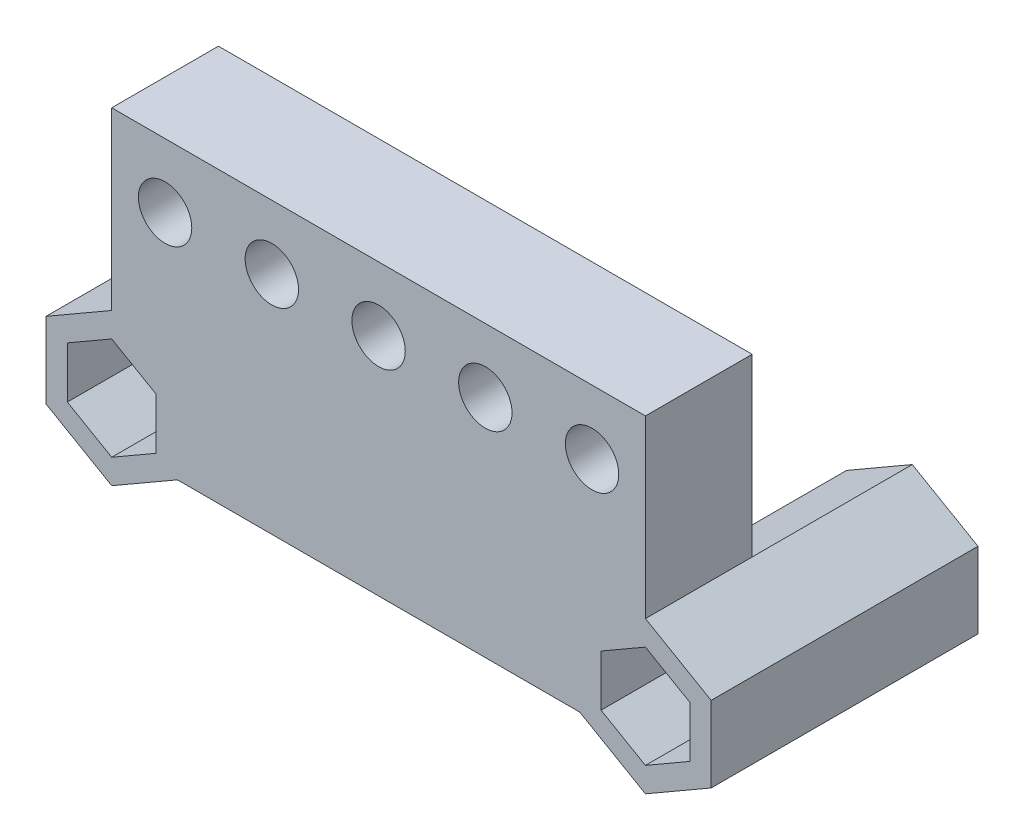
ISO-10303-21;
HEADER;
FILE_DESCRIPTION(('STEP AP214'),'2;1');
FILE_NAME('part.step','',(''),(''),'','','');
FILE_SCHEMA(('AUTOMOTIVE_DESIGN { 1 0 10303 214 1 1 1 1 }'));
ENDSEC;
DATA;
#1=APPLICATION_CONTEXT('core data for automotive mechanical design processes');
#2=APPLICATION_PROTOCOL_DEFINITION('international standard','automotive_design',2000,#1);
#3=PRODUCT_CONTEXT('',#1,'mechanical');
#4=PRODUCT('Part','Part','',(#3));
#5=PRODUCT_RELATED_PRODUCT_CATEGORY('part','',(#4));
#6=PRODUCT_DEFINITION_FORMATION('','',#4);
#7=PRODUCT_DEFINITION_CONTEXT('part definition',#1,'design');
#8=PRODUCT_DEFINITION('design','',#6,#7);
#9=PRODUCT_DEFINITION_SHAPE('','',#8);
#10=(LENGTH_UNIT() NAMED_UNIT(*) SI_UNIT(.MILLI.,.METRE.));
#11=(NAMED_UNIT(*) PLANE_ANGLE_UNIT() SI_UNIT($,.RADIAN.));
#12=(NAMED_UNIT(*) SI_UNIT($,.STERADIAN.) SOLID_ANGLE_UNIT());
#13=UNCERTAINTY_MEASURE_WITH_UNIT(LENGTH_MEASURE(1.E-05),#10,'distance_accuracy_value','');
#14=(GEOMETRIC_REPRESENTATION_CONTEXT(3) GLOBAL_UNCERTAINTY_ASSIGNED_CONTEXT((#13)) GLOBAL_UNIT_ASSIGNED_CONTEXT((#10,
#11,#12)) REPRESENTATION_CONTEXT('',''));
#15=CARTESIAN_POINT('',(0.,0.,0.));
#16=DIRECTION('',(0.,0.,1.));
#17=DIRECTION('',(1.,0.,0.));
#18=AXIS2_PLACEMENT_3D('',#15,#16,#17);
#19=CARTESIAN_POINT('',(6.15692193816531,3.55470053837925,25.));
#20=DIRECTION('',(-0.5,-0.866025403784439,0.));
#21=DIRECTION('',(0.866025403784439,-0.5,0.));
#22=AXIS2_PLACEMENT_3D('',#19,#20,#21);
#23=PLANE('',#22);
#24=DIRECTION('',(-0.866025403784439,0.5,0.));
#25=VECTOR('',#24,1.);
#26=CARTESIAN_POINT('',(6.15692193816531,3.55470053837925,15.));
#27=LINE('',#26,#25);
#28=CARTESIAN_POINT('',(6.15692193816531,3.55470053837925,15.));
#29=VERTEX_POINT('',#28);
#30=CARTESIAN_POINT('',(0.,7.1094010767585,15.));
#31=VERTEX_POINT('',#30);
#32=EDGE_CURVE('E366',#29,#31,#27,.T.);
#33=ORIENTED_EDGE('',*,*,#32,.F.);
#34=DIRECTION('',(0.,0.,-1.));
#35=VECTOR('',#34,1.);
#36=CARTESIAN_POINT('',(6.15692193816531,3.55470053837925,25.));
#37=LINE('',#36,#35);
#38=CARTESIAN_POINT('',(6.15692193816531,3.55470053837925,0.));
#39=VERTEX_POINT('',#38);
#40=EDGE_CURVE('E445',#29,#39,#37,.T.);
#41=ORIENTED_EDGE('',*,*,#40,.T.);
#42=DIRECTION('',(-0.866025403784439,0.5,0.));
#43=VECTOR('',#42,1.);
#44=CARTESIAN_POINT('',(6.15692193816531,3.55470053837925,0.));
#45=LINE('',#44,#43);
#46=CARTESIAN_POINT('',(0.,7.1094010767585,0.));
#47=VERTEX_POINT('',#46);
#48=EDGE_CURVE('E426',#39,#47,#45,.T.);
#49=ORIENTED_EDGE('',*,*,#48,.T.);
#50=DIRECTION('',(0.,0.,-1.));
#51=VECTOR('',#50,1.);
#52=CARTESIAN_POINT('',(0.,7.1094010767585,25.));
#53=LINE('',#52,#51);
#54=EDGE_CURVE('E50',#31,#47,#53,.T.);
#55=ORIENTED_EDGE('',*,*,#54,.F.);
#56=EDGE_LOOP('',(#33,#41,#49,#55));
#57=FACE_BOUND('',#56,.T.);
#58=ADVANCED_FACE('F33',(#57),#23,.F.);
#59=CARTESIAN_POINT('',(50.,7.10940107675851,25.));
#60=DIRECTION('',(0.5,-0.866025403784439,0.));
#61=DIRECTION('',(0.866025403784439,0.5,0.));
#62=AXIS2_PLACEMENT_3D('',#59,#60,#61);
#63=PLANE('',#62);
#64=DIRECTION('',(-0.866025403784438,-0.500000000000001,0.));
#65=VECTOR('',#64,1.);
#66=CARTESIAN_POINT('',(50.,7.10940107675851,15.));
#67=LINE('',#66,#65);
#68=CARTESIAN_POINT('',(50.,7.10940107675851,15.));
#69=VERTEX_POINT('',#68);
#70=CARTESIAN_POINT('',(43.8430780618347,3.55470053837925,15.));
#71=VERTEX_POINT('',#70);
#72=EDGE_CURVE('E58',#69,#71,#67,.T.);
#73=ORIENTED_EDGE('',*,*,#72,.F.);
#74=DIRECTION('',(0.,0.,-1.));
#75=VECTOR('',#74,1.);
#76=CARTESIAN_POINT('',(50.,7.10940107675851,25.));
#77=LINE('',#76,#75);
#78=CARTESIAN_POINT('',(50.,7.10940107675851,0.));
#79=VERTEX_POINT('',#78);
#80=EDGE_CURVE('E335',#69,#79,#77,.T.);
#81=ORIENTED_EDGE('',*,*,#80,.T.);
#82=DIRECTION('',(-0.866025403784439,-0.5,0.));
#83=VECTOR('',#82,1.);
#84=CARTESIAN_POINT('',(50.,7.10940107675851,0.));
#85=LINE('',#84,#83);
#86=CARTESIAN_POINT('',(43.8430780618347,3.55470053837926,0.));
#87=VERTEX_POINT('',#86);
#88=EDGE_CURVE('E309',#79,#87,#85,.T.);
#89=ORIENTED_EDGE('',*,*,#88,.T.);
#90=DIRECTION('',(0.,0.,-1.));
#91=VECTOR('',#90,1.);
#92=CARTESIAN_POINT('',(43.8430780618347,3.55470053837926,25.));
#93=LINE('',#92,#91);
#94=EDGE_CURVE('E314',#71,#87,#93,.T.);
#95=ORIENTED_EDGE('',*,*,#94,.F.);
#96=EDGE_LOOP('',(#73,#81,#89,#95));
#97=FACE_BOUND('',#96,.T.);
#98=ADVANCED_FACE('F565',(#97),#63,.F.);
#99=CARTESIAN_POINT('',(6.15692193816531,-3.55470053837925,25.));
#100=DIRECTION('',(-1.,0.,0.));
#101=DIRECTION('',(0.,0.,1.));
#102=AXIS2_PLACEMENT_3D('',#99,#100,#101);
#103=PLANE('',#102);
#104=DIRECTION('',(0.,1.,0.));
#105=VECTOR('',#104,1.);
#106=CARTESIAN_POINT('',(6.15692193816531,-3.55470053837925,15.));
#107=LINE('',#106,#105);
#108=CARTESIAN_POINT('',(6.15692193816531,-3.55470053837925,15.));
#109=VERTEX_POINT('',#108);
#110=EDGE_CURVE('E343',#109,#29,#107,.T.);
#111=ORIENTED_EDGE('',*,*,#110,.F.);
#112=DIRECTION('',(0.,0.,-1.));
#113=VECTOR('',#112,1.);
#114=CARTESIAN_POINT('',(6.15692193816531,-3.55470053837925,25.));
#115=LINE('',#114,#113);
#116=CARTESIAN_POINT('',(6.15692193816531,-3.55470053837925,0.));
#117=VERTEX_POINT('',#116);
#118=EDGE_CURVE('E450',#109,#117,#115,.T.);
#119=ORIENTED_EDGE('',*,*,#118,.T.);
#120=DIRECTION('',(0.,1.,0.));
#121=VECTOR('',#120,1.);
#122=CARTESIAN_POINT('',(6.15692193816531,-3.55470053837925,0.));
#123=LINE('',#122,#121);
#124=EDGE_CURVE('E440',#117,#39,#123,.T.);
#125=ORIENTED_EDGE('',*,*,#124,.T.);
#126=ORIENTED_EDGE('',*,*,#40,.F.);
#127=EDGE_LOOP('',(#111,#119,#125,#126));
#128=FACE_BOUND('',#127,.T.);
#129=ADVANCED_FACE('F471',(#128),#103,.F.);
#130=CARTESIAN_POINT('',(0.,0.,25.));
#131=DIRECTION('',(0.,0.,1.));
#132=DIRECTION('',(1.,0.,0.));
#133=AXIS2_PLACEMENT_3D('',#130,#131,#132);
#134=PLANE('',#133);
#135=CARTESIAN_POINT('',(5.,17.5547005383792,25.));
#136=DIRECTION('',(0.,0.,1.));
#137=DIRECTION('',(1.,0.,0.));
#138=AXIS2_PLACEMENT_3D('',#135,#136,#137);
#139=CIRCLE('',#138,2.5);
#140=CARTESIAN_POINT('',(7.5,17.5547005383792,25.));
#141=VERTEX_POINT('',#140);
#142=EDGE_CURVE('E392',#141,#141,#139,.T.);
#143=ORIENTED_EDGE('',*,*,#142,.F.);
#144=EDGE_LOOP('',(#143));
#145=FACE_BOUND('',#144,.T.);
#146=CARTESIAN_POINT('',(15.,17.5547005383793,25.));
#147=DIRECTION('',(0.,0.,1.));
#148=DIRECTION('',(1.,0.,0.));
#149=AXIS2_PLACEMENT_3D('',#146,#147,#148);
#150=CIRCLE('',#149,2.49999999999999);
#151=CARTESIAN_POINT('',(17.5,17.5547005383793,25.));
#152=VERTEX_POINT('',#151);
#153=EDGE_CURVE('E382',#152,#152,#150,.T.);
#154=ORIENTED_EDGE('',*,*,#153,.F.);
#155=EDGE_LOOP('',(#154));
#156=FACE_BOUND('',#155,.T.);
#157=CARTESIAN_POINT('',(45.,17.5547005383793,25.));
#158=DIRECTION('',(0.,0.,1.));
#159=DIRECTION('',(1.,0.,0.));
#160=AXIS2_PLACEMENT_3D('',#157,#158,#159);
#161=CIRCLE('',#160,2.5);
#162=CARTESIAN_POINT('',(47.5,17.5547005383793,25.));
#163=VERTEX_POINT('',#162);
#164=EDGE_CURVE('E379',#163,#163,#161,.T.);
#165=ORIENTED_EDGE('',*,*,#164,.F.);
#166=EDGE_LOOP('',(#165));
#167=FACE_BOUND('',#166,.T.);
#168=CARTESIAN_POINT('',(35.,17.5547005383793,25.));
#169=DIRECTION('',(0.,0.,1.));
#170=DIRECTION('',(1.,0.,0.));
#171=AXIS2_PLACEMENT_3D('',#168,#169,#170);
#172=CIRCLE('',#171,2.5);
#173=CARTESIAN_POINT('',(37.5,17.5547005383793,25.));
#174=VERTEX_POINT('',#173);
#175=EDGE_CURVE('E376',#174,#174,#172,.T.);
#176=ORIENTED_EDGE('',*,*,#175,.F.);
#177=EDGE_LOOP('',(#176));
#178=FACE_BOUND('',#177,.T.);
#179=CARTESIAN_POINT('',(25.,17.5547005383793,25.));
#180=DIRECTION('',(0.,0.,1.));
#181=DIRECTION('',(1.,0.,0.));
#182=AXIS2_PLACEMENT_3D('',#179,#180,#181);
#183=CIRCLE('',#182,2.5);
#184=CARTESIAN_POINT('',(27.5,17.5547005383793,25.));
#185=VERTEX_POINT('',#184);
#186=EDGE_CURVE('E250',#185,#185,#183,.T.);
#187=ORIENTED_EDGE('',*,*,#186,.F.);
#188=EDGE_LOOP('',(#187));
#189=FACE_BOUND('',#188,.T.);
#190=DIRECTION('',(0.,-1.,0.));
#191=VECTOR('',#190,1.);
#192=CARTESIAN_POINT('',(0.,23.5547005383792,25.));
#193=LINE('',#192,#191);
#194=CARTESIAN_POINT('',(0.,23.5547005383792,25.));
#195=VERTEX_POINT('',#194);
#196=CARTESIAN_POINT('',(0.,7.1094010767585,25.));
#197=VERTEX_POINT('',#196);
#198=EDGE_CURVE('E232',#195,#197,#193,.T.);
#199=ORIENTED_EDGE('',*,*,#198,.T.);
#200=DIRECTION('',(-0.866025403784439,-0.5,0.));
#201=VECTOR('',#200,1.);
#202=CARTESIAN_POINT('',(0.,7.1094010767585,25.));
#203=LINE('',#202,#201);
#204=CARTESIAN_POINT('',(-6.1569219381653,3.55470053837925,25.));
#205=VERTEX_POINT('',#204);
#206=EDGE_CURVE('E406',#197,#205,#203,.T.);
#207=ORIENTED_EDGE('',*,*,#206,.T.);
#208=DIRECTION('',(0.,-1.,0.));
#209=VECTOR('',#208,1.);
#210=CARTESIAN_POINT('',(-6.1569219381653,3.55470053837925,25.));
#211=LINE('',#210,#209);
#212=CARTESIAN_POINT('',(-6.1569219381653,-3.55470053837925,25.));
#213=VERTEX_POINT('',#212);
#214=EDGE_CURVE('E409',#205,#213,#211,.T.);
#215=ORIENTED_EDGE('',*,*,#214,.T.);
#216=DIRECTION('',(0.866025403784439,-0.5,0.));
#217=VECTOR('',#216,1.);
#218=CARTESIAN_POINT('',(-6.1569219381653,-3.55470053837925,25.));
#219=LINE('',#218,#217);
#220=CARTESIAN_POINT('',(0.,-7.1094010767585,25.));
#221=VERTEX_POINT('',#220);
#222=EDGE_CURVE('E423',#213,#221,#219,.T.);
#223=ORIENTED_EDGE('',*,*,#222,.T.);
#224=DIRECTION('',(0.866025403784439,0.5,0.));
#225=VECTOR('',#224,1.);
#226=CARTESIAN_POINT('',(0.,-7.1094010767585,25.));
#227=LINE('',#226,#225);
#228=CARTESIAN_POINT('',(6.15692193816531,-3.55470053837925,25.));
#229=VERTEX_POINT('',#228);
#230=EDGE_CURVE('E413',#221,#229,#227,.T.);
#231=ORIENTED_EDGE('',*,*,#230,.T.);
#232=DIRECTION('',(-1.,0.,0.));
#233=VECTOR('',#232,1.);
#234=CARTESIAN_POINT('',(56.1126984174209,-3.55470053837925,25.));
#235=LINE('',#234,#233);
#236=CARTESIAN_POINT('',(43.8430780618347,-3.55470053837925,25.));
#237=VERTEX_POINT('',#236);
#238=EDGE_CURVE('E354',#237,#229,#235,.T.);
#239=ORIENTED_EDGE('',*,*,#238,.F.);
#240=DIRECTION('',(0.866025403784439,-0.5,0.));
#241=VECTOR('',#240,1.);
#242=CARTESIAN_POINT('',(43.8430780618347,-3.55470053837925,25.));
#243=LINE('',#242,#241);
#244=CARTESIAN_POINT('',(50.,-7.1094010767585,25.));
#245=VERTEX_POINT('',#244);
#246=EDGE_CURVE('E306',#237,#245,#243,.T.);
#247=ORIENTED_EDGE('',*,*,#246,.T.);
#248=DIRECTION('',(0.866025403784438,0.5,0.));
#249=VECTOR('',#248,1.);
#250=CARTESIAN_POINT('',(50.,-7.1094010767585,25.));
#251=LINE('',#250,#249);
#252=CARTESIAN_POINT('',(56.1569219381653,-3.55470053837925,25.));
#253=VERTEX_POINT('',#252);
#254=EDGE_CURVE('E308',#245,#253,#251,.T.);
#255=ORIENTED_EDGE('',*,*,#254,.T.);
#256=DIRECTION('',(0.,1.,0.));
#257=VECTOR('',#256,1.);
#258=CARTESIAN_POINT('',(56.1569219381653,-3.55470053837925,25.));
#259=LINE('',#258,#257);
#260=CARTESIAN_POINT('',(56.1569219381653,3.55470053837926,25.));
#261=VERTEX_POINT('',#260);
#262=EDGE_CURVE('E311',#253,#261,#259,.T.);
#263=ORIENTED_EDGE('',*,*,#262,.T.);
#264=DIRECTION('',(-0.866025403784439,0.5,0.));
#265=VECTOR('',#264,1.);
#266=CARTESIAN_POINT('',(56.1569219381653,3.55470053837926,25.));
#267=LINE('',#266,#265);
#268=CARTESIAN_POINT('',(50.,7.10940107675851,25.));
#269=VERTEX_POINT('',#268);
#270=EDGE_CURVE('E245',#261,#269,#267,.T.);
#271=ORIENTED_EDGE('',*,*,#270,.T.);
#272=DIRECTION('',(0.,1.,0.));
#273=VECTOR('',#272,1.);
#274=CARTESIAN_POINT('',(50.,7.10940107675851,25.));
#275=LINE('',#274,#273);
#276=CARTESIAN_POINT('',(50.,23.5547005383793,25.));
#277=VERTEX_POINT('',#276);
#278=EDGE_CURVE('E226',#269,#277,#275,.T.);
#279=ORIENTED_EDGE('',*,*,#278,.T.);
#280=DIRECTION('',(-1.,0.,0.));
#281=VECTOR('',#280,1.);
#282=CARTESIAN_POINT('',(50.,23.5547005383793,25.));
#283=LINE('',#282,#281);
#284=EDGE_CURVE('E235',#277,#195,#283,.T.);
#285=ORIENTED_EDGE('',*,*,#284,.T.);
#286=EDGE_LOOP('',(#199,#207,#215,#223,#231,#239,#247,#255,#263,#271,#279,#285));
#287=FACE_BOUND('',#286,.T.);
#288=DIRECTION('',(0.,-1.,0.));
#289=VECTOR('',#288,1.);
#290=CARTESIAN_POINT('',(-4.1569219381653,2.4,25.));
#291=LINE('',#290,#289);
#292=CARTESIAN_POINT('',(-4.1569219381653,2.4,25.));
#293=VERTEX_POINT('',#292);
#294=CARTESIAN_POINT('',(-4.1569219381653,-2.4,25.));
#295=VERTEX_POINT('',#294);
#296=EDGE_CURVE('E490',#293,#295,#291,.T.);
#297=ORIENTED_EDGE('',*,*,#296,.F.);
#298=DIRECTION('',(-0.866025403784439,-0.5,0.));
#299=VECTOR('',#298,1.);
#300=CARTESIAN_POINT('',(0.,4.8,25.));
#301=LINE('',#300,#299);
#302=CARTESIAN_POINT('',(0.,4.8,25.));
#303=VERTEX_POINT('',#302);
#304=EDGE_CURVE('E488',#303,#293,#301,.T.);
#305=ORIENTED_EDGE('',*,*,#304,.F.);
#306=DIRECTION('',(-0.866025403784438,0.5,0.));
#307=VECTOR('',#306,1.);
#308=CARTESIAN_POINT('',(4.15692193816531,2.4,25.));
#309=LINE('',#308,#307);
#310=CARTESIAN_POINT('',(4.15692193816531,2.4,25.));
#311=VERTEX_POINT('',#310);
#312=EDGE_CURVE('E500',#311,#303,#309,.T.);
#313=ORIENTED_EDGE('',*,*,#312,.F.);
#314=DIRECTION('',(0.,1.,0.));
#315=VECTOR('',#314,1.);
#316=CARTESIAN_POINT('',(4.15692193816531,-2.4,25.));
#317=LINE('',#316,#315);
#318=CARTESIAN_POINT('',(4.15692193816531,-2.4,25.));
#319=VERTEX_POINT('',#318);
#320=EDGE_CURVE('E497',#319,#311,#317,.T.);
#321=ORIENTED_EDGE('',*,*,#320,.F.);
#322=DIRECTION('',(0.866025403784438,0.5,0.));
#323=VECTOR('',#322,1.);
#324=CARTESIAN_POINT('',(0.,-4.8,25.));
#325=LINE('',#324,#323);
#326=CARTESIAN_POINT('',(0.,-4.8,25.));
#327=VERTEX_POINT('',#326);
#328=EDGE_CURVE('E495',#327,#319,#325,.T.);
#329=ORIENTED_EDGE('',*,*,#328,.F.);
#330=DIRECTION('',(0.866025403784439,-0.5,0.));
#331=VECTOR('',#330,1.);
#332=CARTESIAN_POINT('',(-4.1569219381653,-2.4,25.));
#333=LINE('',#332,#331);
#334=EDGE_CURVE('E493',#295,#327,#333,.T.);
#335=ORIENTED_EDGE('',*,*,#334,.F.);
#336=EDGE_LOOP('',(#297,#305,#313,#321,#329,#335));
#337=FACE_BOUND('',#336,.T.);
#338=DIRECTION('',(0.866025403784439,-0.5,0.));
#339=VECTOR('',#338,1.);
#340=CARTESIAN_POINT('',(45.8430780618347,-2.4,25.));
#341=LINE('',#340,#339);
#342=CARTESIAN_POINT('',(45.8430780618347,-2.4,25.));
#343=VERTEX_POINT('',#342);
#344=CARTESIAN_POINT('',(50.,-4.8,25.));
#345=VERTEX_POINT('',#344);
#346=EDGE_CURVE('E263',#343,#345,#341,.T.);
#347=ORIENTED_EDGE('',*,*,#346,.F.);
#348=DIRECTION('',(0.,-1.,0.));
#349=VECTOR('',#348,1.);
#350=CARTESIAN_POINT('',(45.8430780618347,2.4,25.));
#351=LINE('',#350,#349);
#352=CARTESIAN_POINT('',(45.8430780618347,2.4,25.));
#353=VERTEX_POINT('',#352);
#354=EDGE_CURVE('E261',#353,#343,#351,.T.);
#355=ORIENTED_EDGE('',*,*,#354,.F.);
#356=DIRECTION('',(-0.866025403784439,-0.5,0.));
#357=VECTOR('',#356,1.);
#358=CARTESIAN_POINT('',(50.,4.8,25.));
#359=LINE('',#358,#357);
#360=CARTESIAN_POINT('',(50.,4.8,25.));
#361=VERTEX_POINT('',#360);
#362=EDGE_CURVE('E273',#361,#353,#359,.T.);
#363=ORIENTED_EDGE('',*,*,#362,.F.);
#364=DIRECTION('',(-0.866025403784439,0.499999999999999,0.));
#365=VECTOR('',#364,1.);
#366=CARTESIAN_POINT('',(54.1569219381653,2.40000000000001,25.));
#367=LINE('',#366,#365);
#368=CARTESIAN_POINT('',(54.1569219381653,2.40000000000001,25.));
#369=VERTEX_POINT('',#368);
#370=EDGE_CURVE('E270',#369,#361,#367,.T.);
#371=ORIENTED_EDGE('',*,*,#370,.F.);
#372=DIRECTION('',(0.,1.,0.));
#373=VECTOR('',#372,1.);
#374=CARTESIAN_POINT('',(54.1569219381653,-2.40000000000001,25.));
#375=LINE('',#374,#373);
#376=CARTESIAN_POINT('',(54.1569219381653,-2.40000000000001,25.));
#377=VERTEX_POINT('',#376);
#378=EDGE_CURVE('E268',#377,#369,#375,.T.);
#379=ORIENTED_EDGE('',*,*,#378,.F.);
#380=DIRECTION('',(0.866025403784439,0.499999999999999,0.));
#381=VECTOR('',#380,1.);
#382=CARTESIAN_POINT('',(50.,-4.8,25.));
#383=LINE('',#382,#381);
#384=EDGE_CURVE('E266',#345,#377,#383,.T.);
#385=ORIENTED_EDGE('',*,*,#384,.F.);
#386=EDGE_LOOP('',(#347,#355,#363,#371,#379,#385));
#387=FACE_BOUND('',#386,.T.);
#388=ADVANCED_FACE('F242',(#145,#156,#167,#178,#189,#287,#337,#387),#134,.T.);
#389=CARTESIAN_POINT('',(0.,0.,0.));
#390=DIRECTION('',(0.,0.,1.));
#391=DIRECTION('',(1.,0.,0.));
#392=AXIS2_PLACEMENT_3D('',#389,#390,#391);
#393=PLANE('',#392);
#394=DIRECTION('',(0.,-1.,0.));
#395=VECTOR('',#394,1.);
#396=CARTESIAN_POINT('',(-6.1569219381653,3.55470053837925,0.));
#397=LINE('',#396,#395);
#398=CARTESIAN_POINT('',(-6.1569219381653,3.55470053837925,0.));
#399=VERTEX_POINT('',#398);
#400=CARTESIAN_POINT('',(-6.1569219381653,-3.55470053837925,0.));
#401=VERTEX_POINT('',#400);
#402=EDGE_CURVE('E433',#399,#401,#397,.T.);
#403=ORIENTED_EDGE('',*,*,#402,.F.);
#404=DIRECTION('',(-0.866025403784439,-0.5,0.));
#405=VECTOR('',#404,1.);
#406=CARTESIAN_POINT('',(0.,7.1094010767585,0.));
#407=LINE('',#406,#405);
#408=EDGE_CURVE('E418',#47,#399,#407,.T.);
#409=ORIENTED_EDGE('',*,*,#408,.F.);
#410=ORIENTED_EDGE('',*,*,#48,.F.);
#411=ORIENTED_EDGE('',*,*,#124,.F.);
#412=DIRECTION('',(0.866025403784439,0.5,0.));
#413=VECTOR('',#412,1.);
#414=CARTESIAN_POINT('',(0.,-7.1094010767585,0.));
#415=LINE('',#414,#413);
#416=CARTESIAN_POINT('',(0.,-7.1094010767585,0.));
#417=VERTEX_POINT('',#416);
#418=EDGE_CURVE('E437',#417,#117,#415,.T.);
#419=ORIENTED_EDGE('',*,*,#418,.F.);
#420=DIRECTION('',(0.866025403784439,-0.5,0.));
#421=VECTOR('',#420,1.);
#422=CARTESIAN_POINT('',(-6.1569219381653,-3.55470053837925,0.));
#423=LINE('',#422,#421);
#424=EDGE_CURVE('E435',#401,#417,#423,.T.);
#425=ORIENTED_EDGE('',*,*,#424,.F.);
#426=EDGE_LOOP('',(#403,#409,#410,#411,#419,#425));
#427=FACE_BOUND('',#426,.T.);
#428=DIRECTION('',(-0.866025403784439,-0.5,0.));
#429=VECTOR('',#428,1.);
#430=CARTESIAN_POINT('',(0.,4.8,0.));
#431=LINE('',#430,#429);
#432=CARTESIAN_POINT('',(0.,4.8,0.));
#433=VERTEX_POINT('',#432);
#434=CARTESIAN_POINT('',(-4.1569219381653,2.4,0.));
#435=VERTEX_POINT('',#434);
#436=EDGE_CURVE('E360',#433,#435,#431,.T.);
#437=ORIENTED_EDGE('',*,*,#436,.T.);
#438=DIRECTION('',(0.,-1.,0.));
#439=VECTOR('',#438,1.);
#440=CARTESIAN_POINT('',(-4.1569219381653,2.4,0.));
#441=LINE('',#440,#439);
#442=CARTESIAN_POINT('',(-4.1569219381653,-2.4,0.));
#443=VERTEX_POINT('',#442);
#444=EDGE_CURVE('E505',#435,#443,#441,.T.);
#445=ORIENTED_EDGE('',*,*,#444,.T.);
#446=DIRECTION('',(0.866025403784439,-0.5,0.));
#447=VECTOR('',#446,1.);
#448=CARTESIAN_POINT('',(-4.1569219381653,-2.4,0.));
#449=LINE('',#448,#447);
#450=CARTESIAN_POINT('',(0.,-4.8,0.));
#451=VERTEX_POINT('',#450);
#452=EDGE_CURVE('E508',#443,#451,#449,.T.);
#453=ORIENTED_EDGE('',*,*,#452,.T.);
#454=DIRECTION('',(0.866025403784438,0.5,0.));
#455=VECTOR('',#454,1.);
#456=CARTESIAN_POINT('',(0.,-4.8,0.));
#457=LINE('',#456,#455);
#458=CARTESIAN_POINT('',(4.15692193816531,-2.4,0.));
#459=VERTEX_POINT('',#458);
#460=EDGE_CURVE('E511',#451,#459,#457,.T.);
#461=ORIENTED_EDGE('',*,*,#460,.T.);
#462=DIRECTION('',(0.,1.,0.));
#463=VECTOR('',#462,1.);
#464=CARTESIAN_POINT('',(4.15692193816531,-2.4,0.));
#465=LINE('',#464,#463);
#466=CARTESIAN_POINT('',(4.15692193816531,2.4,0.));
#467=VERTEX_POINT('',#466);
#468=EDGE_CURVE('E514',#459,#467,#465,.T.);
#469=ORIENTED_EDGE('',*,*,#468,.T.);
#470=DIRECTION('',(-0.866025403784438,0.5,0.));
#471=VECTOR('',#470,1.);
#472=CARTESIAN_POINT('',(4.15692193816531,2.4,0.));
#473=LINE('',#472,#471);
#474=EDGE_CURVE('E491',#467,#433,#473,.T.);
#475=ORIENTED_EDGE('',*,*,#474,.T.);
#476=EDGE_LOOP('',(#437,#445,#453,#461,#469,#475));
#477=FACE_BOUND('',#476,.T.);
#478=ADVANCED_FACE('F467',(#427,#477),#393,.F.);
#479=CARTESIAN_POINT('',(-6.1569219381653,3.55470053837925,25.));
#480=DIRECTION('',(1.,0.,0.));
#481=DIRECTION('',(0.,0.,-1.));
#482=AXIS2_PLACEMENT_3D('',#479,#480,#481);
#483=PLANE('',#482);
#484=ORIENTED_EDGE('',*,*,#402,.T.);
#485=DIRECTION('',(0.,0.,-1.));
#486=VECTOR('',#485,1.);
#487=CARTESIAN_POINT('',(-6.1569219381653,-3.55470053837925,25.));
#488=LINE('',#487,#486);
#489=EDGE_CURVE('E11',#213,#401,#488,.T.);
#490=ORIENTED_EDGE('',*,*,#489,.F.);
#491=ORIENTED_EDGE('',*,*,#214,.F.);
#492=DIRECTION('',(0.,0.,-1.));
#493=VECTOR('',#492,1.);
#494=CARTESIAN_POINT('',(-6.1569219381653,3.55470053837925,25.));
#495=LINE('',#494,#493);
#496=EDGE_CURVE('E412',#205,#399,#495,.T.);
#497=ORIENTED_EDGE('',*,*,#496,.T.);
#498=EDGE_LOOP('',(#484,#490,#491,#497));
#499=FACE_BOUND('',#498,.T.);
#500=ADVANCED_FACE('F35',(#499),#483,.F.);
#501=CARTESIAN_POINT('',(-6.1569219381653,-3.55470053837925,25.));
#502=DIRECTION('',(0.5,0.866025403784439,0.));
#503=DIRECTION('',(-0.866025403784439,0.5,0.));
#504=AXIS2_PLACEMENT_3D('',#501,#502,#503);
#505=PLANE('',#504);
#506=ORIENTED_EDGE('',*,*,#424,.T.);
#507=DIRECTION('',(0.,0.,-1.));
#508=VECTOR('',#507,1.);
#509=CARTESIAN_POINT('',(0.,-7.1094010767585,25.));
#510=LINE('',#509,#508);
#511=EDGE_CURVE('E42',#221,#417,#510,.T.);
#512=ORIENTED_EDGE('',*,*,#511,.F.);
#513=ORIENTED_EDGE('',*,*,#222,.F.);
#514=ORIENTED_EDGE('',*,*,#489,.T.);
#515=EDGE_LOOP('',(#506,#512,#513,#514));
#516=FACE_BOUND('',#515,.T.);
#517=ADVANCED_FACE('F577',(#516),#505,.F.);
#518=CARTESIAN_POINT('',(0.,-7.1094010767585,25.));
#519=DIRECTION('',(-0.5,0.866025403784439,0.));
#520=DIRECTION('',(-0.866025403784439,-0.5,0.));
#521=AXIS2_PLACEMENT_3D('',#518,#519,#520);
#522=PLANE('',#521);
#523=ORIENTED_EDGE('',*,*,#418,.T.);
#524=ORIENTED_EDGE('',*,*,#118,.F.);
#525=EDGE_CURVE('E349',#229,#109,#115,.T.);
#526=ORIENTED_EDGE('',*,*,#525,.F.);
#527=ORIENTED_EDGE('',*,*,#230,.F.);
#528=ORIENTED_EDGE('',*,*,#511,.T.);
#529=EDGE_LOOP('',(#523,#524,#526,#527,#528));
#530=FACE_BOUND('',#529,.T.);
#531=ADVANCED_FACE('F463',(#530),#522,.F.);
#532=CARTESIAN_POINT('',(0.,7.1094010767585,25.));
#533=DIRECTION('',(0.5,-0.866025403784439,0.));
#534=DIRECTION('',(0.866025403784439,0.5,0.));
#535=AXIS2_PLACEMENT_3D('',#532,#533,#534);
#536=PLANE('',#535);
#537=ORIENTED_EDGE('',*,*,#408,.T.);
#538=ORIENTED_EDGE('',*,*,#496,.F.);
#539=ORIENTED_EDGE('',*,*,#206,.F.);
#540=EDGE_CURVE('E404',#197,#31,#53,.T.);
#541=ORIENTED_EDGE('',*,*,#540,.T.);
#542=ORIENTED_EDGE('',*,*,#54,.T.);
#543=EDGE_LOOP('',(#537,#538,#539,#541,#542));
#544=FACE_BOUND('',#543,.T.);
#545=ADVANCED_FACE('F416',(#544),#536,.F.);
#546=CARTESIAN_POINT('',(0.,4.8,25.));
#547=DIRECTION('',(0.5,-0.866025403784439,0.));
#548=DIRECTION('',(0.866025403784439,0.5,0.));
#549=AXIS2_PLACEMENT_3D('',#546,#547,#548);
#550=PLANE('',#549);
#551=ORIENTED_EDGE('',*,*,#436,.F.);
#552=DIRECTION('',(0.,0.,-1.));
#553=VECTOR('',#552,1.);
#554=CARTESIAN_POINT('',(0.,4.8,25.));
#555=LINE('',#554,#553);
#556=EDGE_CURVE('E502',#303,#433,#555,.T.);
#557=ORIENTED_EDGE('',*,*,#556,.F.);
#558=ORIENTED_EDGE('',*,*,#304,.T.);
#559=DIRECTION('',(0.,0.,-1.));
#560=VECTOR('',#559,1.);
#561=CARTESIAN_POINT('',(-4.1569219381653,2.4,25.));
#562=LINE('',#561,#560);
#563=EDGE_CURVE('E429',#293,#435,#562,.T.);
#564=ORIENTED_EDGE('',*,*,#563,.T.);
#565=EDGE_LOOP('',(#551,#557,#558,#564));
#566=FACE_BOUND('',#565,.T.);
#567=ADVANCED_FACE('F533',(#566),#550,.T.);
#568=CARTESIAN_POINT('',(-4.1569219381653,2.4,25.));
#569=DIRECTION('',(1.,0.,0.));
#570=DIRECTION('',(0.,0.,-1.));
#571=AXIS2_PLACEMENT_3D('',#568,#569,#570);
#572=PLANE('',#571);
#573=ORIENTED_EDGE('',*,*,#444,.F.);
#574=ORIENTED_EDGE('',*,*,#563,.F.);
#575=ORIENTED_EDGE('',*,*,#296,.T.);
#576=DIRECTION('',(0.,0.,-1.));
#577=VECTOR('',#576,1.);
#578=CARTESIAN_POINT('',(-4.1569219381653,-2.4,25.));
#579=LINE('',#578,#577);
#580=EDGE_CURVE('E526',#295,#443,#579,.T.);
#581=ORIENTED_EDGE('',*,*,#580,.T.);
#582=EDGE_LOOP('',(#573,#574,#575,#581));
#583=FACE_BOUND('',#582,.T.);
#584=ADVANCED_FACE('F546',(#583),#572,.T.);
#585=CARTESIAN_POINT('',(-4.1569219381653,-2.4,25.));
#586=DIRECTION('',(0.5,0.866025403784439,0.));
#587=DIRECTION('',(-0.866025403784439,0.5,0.));
#588=AXIS2_PLACEMENT_3D('',#585,#586,#587);
#589=PLANE('',#588);
#590=ORIENTED_EDGE('',*,*,#452,.F.);
#591=ORIENTED_EDGE('',*,*,#580,.F.);
#592=ORIENTED_EDGE('',*,*,#334,.T.);
#593=DIRECTION('',(0.,0.,-1.));
#594=VECTOR('',#593,1.);
#595=CARTESIAN_POINT('',(0.,-4.8,25.));
#596=LINE('',#595,#594);
#597=EDGE_CURVE('E525',#327,#451,#596,.T.);
#598=ORIENTED_EDGE('',*,*,#597,.T.);
#599=EDGE_LOOP('',(#590,#591,#592,#598));
#600=FACE_BOUND('',#599,.T.);
#601=ADVANCED_FACE('F548',(#600),#589,.T.);
#602=CARTESIAN_POINT('',(0.,-4.8,25.));
#603=DIRECTION('',(-0.5,0.866025403784438,0.));
#604=DIRECTION('',(-0.866025403784439,-0.5,0.));
#605=AXIS2_PLACEMENT_3D('',#602,#603,#604);
#606=PLANE('',#605);
#607=ORIENTED_EDGE('',*,*,#460,.F.);
#608=ORIENTED_EDGE('',*,*,#597,.F.);
#609=ORIENTED_EDGE('',*,*,#328,.T.);
#610=DIRECTION('',(0.,0.,-1.));
#611=VECTOR('',#610,1.);
#612=CARTESIAN_POINT('',(4.15692193816531,-2.4,25.));
#613=LINE('',#612,#611);
#614=EDGE_CURVE('E523',#319,#459,#613,.T.);
#615=ORIENTED_EDGE('',*,*,#614,.T.);
#616=EDGE_LOOP('',(#607,#608,#609,#615));
#617=FACE_BOUND('',#616,.T.);
#618=ADVANCED_FACE('F552',(#617),#606,.T.);
#619=CARTESIAN_POINT('',(4.15692193816531,-2.4,25.));
#620=DIRECTION('',(-1.,0.,0.));
#621=DIRECTION('',(0.,0.,1.));
#622=AXIS2_PLACEMENT_3D('',#619,#620,#621);
#623=PLANE('',#622);
#624=ORIENTED_EDGE('',*,*,#468,.F.);
#625=ORIENTED_EDGE('',*,*,#614,.F.);
#626=ORIENTED_EDGE('',*,*,#320,.T.);
#627=DIRECTION('',(0.,0.,-1.));
#628=VECTOR('',#627,1.);
#629=CARTESIAN_POINT('',(4.15692193816531,2.4,25.));
#630=LINE('',#629,#628);
#631=EDGE_CURVE('E521',#311,#467,#630,.T.);
#632=ORIENTED_EDGE('',*,*,#631,.T.);
#633=EDGE_LOOP('',(#624,#625,#626,#632));
#634=FACE_BOUND('',#633,.T.);
#635=ADVANCED_FACE('F555',(#634),#623,.T.);
#636=CARTESIAN_POINT('',(4.15692193816531,2.4,25.));
#637=DIRECTION('',(-0.5,-0.866025403784438,0.));
#638=DIRECTION('',(0.866025403784438,-0.5,0.));
#639=AXIS2_PLACEMENT_3D('',#636,#637,#638);
#640=PLANE('',#639);
#641=ORIENTED_EDGE('',*,*,#474,.F.);
#642=ORIENTED_EDGE('',*,*,#631,.F.);
#643=ORIENTED_EDGE('',*,*,#312,.T.);
#644=ORIENTED_EDGE('',*,*,#556,.T.);
#645=EDGE_LOOP('',(#641,#642,#643,#644));
#646=FACE_BOUND('',#645,.T.);
#647=ADVANCED_FACE('F540',(#646),#640,.T.);
#648=CARTESIAN_POINT('',(56.1126984174209,-3.55470053837925,25.));
#649=DIRECTION('',(0.,1.,0.));
#650=DIRECTION('',(0.,0.,1.));
#651=AXIS2_PLACEMENT_3D('',#648,#649,#650);
#652=PLANE('',#651);
#653=DIRECTION('',(0.,0.,-1.));
#654=VECTOR('',#653,1.);
#655=CARTESIAN_POINT('',(43.8430780618347,-3.55470053837925,25.));
#656=LINE('',#655,#654);
#657=CARTESIAN_POINT('',(43.8430780618347,-3.55470053837925,15.));
#658=VERTEX_POINT('',#657);
#659=EDGE_CURVE('E347',#237,#658,#656,.T.);
#660=ORIENTED_EDGE('',*,*,#659,.F.);
#661=ORIENTED_EDGE('',*,*,#238,.T.);
#662=ORIENTED_EDGE('',*,*,#525,.T.);
#663=DIRECTION('',(-1.,0.,0.));
#664=VECTOR('',#663,1.);
#665=CARTESIAN_POINT('',(56.1126984174209,-3.55470053837925,15.));
#666=LINE('',#665,#664);
#667=EDGE_CURVE('E348',#658,#109,#666,.T.);
#668=ORIENTED_EDGE('',*,*,#667,.F.);
#669=EDGE_LOOP('',(#660,#661,#662,#668));
#670=FACE_BOUND('',#669,.T.);
#671=ADVANCED_FACE('F473',(#670),#652,.F.);
#672=CARTESIAN_POINT('',(56.1126984174209,-3.55470053837925,15.));
#673=DIRECTION('',(0.,0.,1.));
#674=DIRECTION('',(0.,-1.,0.));
#675=AXIS2_PLACEMENT_3D('',#672,#673,#674);
#676=PLANE('',#675);
#677=CARTESIAN_POINT('',(5.,17.5547005383792,15.));
#678=DIRECTION('',(0.,0.,1.));
#679=DIRECTION('',(0.,-1.,0.));
#680=AXIS2_PLACEMENT_3D('',#677,#678,#679);
#681=CIRCLE('',#680,2.5);
#682=CARTESIAN_POINT('',(5.,15.0547005383792,15.));
#683=VERTEX_POINT('',#682);
#684=EDGE_CURVE('E37',#683,#683,#681,.T.);
#685=ORIENTED_EDGE('',*,*,#684,.T.);
#686=EDGE_LOOP('',(#685));
#687=FACE_BOUND('',#686,.T.);
#688=CARTESIAN_POINT('',(15.,17.5547005383793,15.));
#689=DIRECTION('',(0.,0.,1.));
#690=DIRECTION('',(0.,-1.,0.));
#691=AXIS2_PLACEMENT_3D('',#688,#689,#690);
#692=CIRCLE('',#691,2.49999999999999);
#693=CARTESIAN_POINT('',(15.,15.0547005383793,15.));
#694=VERTEX_POINT('',#693);
#695=EDGE_CURVE('E380',#694,#694,#692,.T.);
#696=ORIENTED_EDGE('',*,*,#695,.T.);
#697=EDGE_LOOP('',(#696));
#698=FACE_BOUND('',#697,.T.);
#699=CARTESIAN_POINT('',(45.,17.5547005383793,15.));
#700=DIRECTION('',(0.,0.,1.));
#701=DIRECTION('',(0.,-1.,0.));
#702=AXIS2_PLACEMENT_3D('',#699,#700,#701);
#703=CIRCLE('',#702,2.5);
#704=CARTESIAN_POINT('',(45.,15.0547005383792,15.));
#705=VERTEX_POINT('',#704);
#706=EDGE_CURVE('E377',#705,#705,#703,.T.);
#707=ORIENTED_EDGE('',*,*,#706,.T.);
#708=EDGE_LOOP('',(#707));
#709=FACE_BOUND('',#708,.T.);
#710=CARTESIAN_POINT('',(35.,17.5547005383793,15.));
#711=DIRECTION('',(0.,0.,1.));
#712=DIRECTION('',(0.,-1.,0.));
#713=AXIS2_PLACEMENT_3D('',#710,#711,#712);
#714=CIRCLE('',#713,2.5);
#715=CARTESIAN_POINT('',(35.,15.0547005383792,15.));
#716=VERTEX_POINT('',#715);
#717=EDGE_CURVE('E373',#716,#716,#714,.T.);
#718=ORIENTED_EDGE('',*,*,#717,.T.);
#719=EDGE_LOOP('',(#718));
#720=FACE_BOUND('',#719,.T.);
#721=CARTESIAN_POINT('',(25.,17.5547005383793,15.));
#722=DIRECTION('',(0.,0.,1.));
#723=DIRECTION('',(0.,-1.,0.));
#724=AXIS2_PLACEMENT_3D('',#721,#722,#723);
#725=CIRCLE('',#724,2.5);
#726=CARTESIAN_POINT('',(25.,15.0547005383793,15.));
#727=VERTEX_POINT('',#726);
#728=EDGE_CURVE('E247',#727,#727,#725,.T.);
#729=ORIENTED_EDGE('',*,*,#728,.T.);
#730=EDGE_LOOP('',(#729));
#731=FACE_BOUND('',#730,.T.);
#732=DIRECTION('',(0.,1.,0.));
#733=VECTOR('',#732,1.);
#734=CARTESIAN_POINT('',(43.8430780618347,-3.55470053837925,15.));
#735=LINE('',#734,#733);
#736=EDGE_CURVE('E357',#658,#71,#735,.T.);
#737=ORIENTED_EDGE('',*,*,#736,.F.);
#738=ORIENTED_EDGE('',*,*,#667,.T.);
#739=ORIENTED_EDGE('',*,*,#110,.T.);
#740=ORIENTED_EDGE('',*,*,#32,.T.);
#741=DIRECTION('',(0.,1.,0.));
#742=VECTOR('',#741,1.);
#743=CARTESIAN_POINT('',(0.,23.5547005383792,15.));
#744=LINE('',#743,#742);
#745=CARTESIAN_POINT('',(0.,23.5547005383792,15.));
#746=VERTEX_POINT('',#745);
#747=EDGE_CURVE('E253',#31,#746,#744,.T.);
#748=ORIENTED_EDGE('',*,*,#747,.T.);
#749=DIRECTION('',(1.,0.,0.));
#750=VECTOR('',#749,1.);
#751=CARTESIAN_POINT('',(50.,23.5547005383793,15.));
#752=LINE('',#751,#750);
#753=CARTESIAN_POINT('',(50.,23.5547005383793,15.));
#754=VERTEX_POINT('',#753);
#755=EDGE_CURVE('E257',#746,#754,#752,.T.);
#756=ORIENTED_EDGE('',*,*,#755,.T.);
#757=DIRECTION('',(0.,-1.,0.));
#758=VECTOR('',#757,1.);
#759=CARTESIAN_POINT('',(50.,7.1094010767585,15.));
#760=LINE('',#759,#758);
#761=EDGE_CURVE('E228',#754,#69,#760,.T.);
#762=ORIENTED_EDGE('',*,*,#761,.T.);
#763=ORIENTED_EDGE('',*,*,#72,.T.);
#764=EDGE_LOOP('',(#737,#738,#739,#740,#748,#756,#762,#763));
#765=FACE_BOUND('',#764,.T.);
#766=ADVANCED_FACE('F400',(#687,#698,#709,#720,#731,#765),#676,.F.);
#767=CARTESIAN_POINT('',(43.8430780618347,3.55470053837926,25.));
#768=DIRECTION('',(1.,0.,0.));
#769=DIRECTION('',(0.,0.,-1.));
#770=AXIS2_PLACEMENT_3D('',#767,#768,#769);
#771=PLANE('',#770);
#772=DIRECTION('',(0.,0.,-1.));
#773=VECTOR('',#772,1.);
#774=CARTESIAN_POINT('',(43.8430780618347,-3.55470053837925,25.));
#775=LINE('',#774,#773);
#776=CARTESIAN_POINT('',(43.8430780618347,-3.55470053837925,0.));
#777=VERTEX_POINT('',#776);
#778=EDGE_CURVE('E336',#658,#777,#775,.T.);
#779=ORIENTED_EDGE('',*,*,#778,.F.);
#780=ORIENTED_EDGE('',*,*,#736,.T.);
#781=ORIENTED_EDGE('',*,*,#94,.T.);
#782=DIRECTION('',(0.,-1.,0.));
#783=VECTOR('',#782,1.);
#784=CARTESIAN_POINT('',(43.8430780618347,3.55470053837926,0.));
#785=LINE('',#784,#783);
#786=EDGE_CURVE('E305',#87,#777,#785,.T.);
#787=ORIENTED_EDGE('',*,*,#786,.T.);
#788=EDGE_LOOP('',(#779,#780,#781,#787));
#789=FACE_BOUND('',#788,.T.);
#790=ADVANCED_FACE('F476',(#789),#771,.F.);
#791=CARTESIAN_POINT('',(0.,0.,0.));
#792=DIRECTION('',(0.,0.,1.));
#793=DIRECTION('',(1.,0.,0.));
#794=AXIS2_PLACEMENT_3D('',#791,#792,#793);
#795=PLANE('',#794);
#796=ORIENTED_EDGE('',*,*,#786,.F.);
#797=ORIENTED_EDGE('',*,*,#88,.F.);
#798=DIRECTION('',(-0.866025403784439,0.5,0.));
#799=VECTOR('',#798,1.);
#800=CARTESIAN_POINT('',(56.1569219381653,3.55470053837926,0.));
#801=LINE('',#800,#799);
#802=CARTESIAN_POINT('',(56.1569219381653,3.55470053837926,0.));
#803=VERTEX_POINT('',#802);
#804=EDGE_CURVE('E323',#803,#79,#801,.T.);
#805=ORIENTED_EDGE('',*,*,#804,.F.);
#806=DIRECTION('',(0.,1.,0.));
#807=VECTOR('',#806,1.);
#808=CARTESIAN_POINT('',(56.1569219381653,-3.55470053837925,0.));
#809=LINE('',#808,#807);
#810=CARTESIAN_POINT('',(56.1569219381653,-3.55470053837925,0.));
#811=VERTEX_POINT('',#810);
#812=EDGE_CURVE('E321',#811,#803,#809,.T.);
#813=ORIENTED_EDGE('',*,*,#812,.F.);
#814=DIRECTION('',(0.866025403784438,0.5,0.));
#815=VECTOR('',#814,1.);
#816=CARTESIAN_POINT('',(50.,-7.1094010767585,0.));
#817=LINE('',#816,#815);
#818=CARTESIAN_POINT('',(50.,-7.1094010767585,0.));
#819=VERTEX_POINT('',#818);
#820=EDGE_CURVE('E319',#819,#811,#817,.T.);
#821=ORIENTED_EDGE('',*,*,#820,.F.);
#822=DIRECTION('',(0.866025403784439,-0.5,0.));
#823=VECTOR('',#822,1.);
#824=CARTESIAN_POINT('',(43.8430780618347,-3.55470053837925,0.));
#825=LINE('',#824,#823);
#826=EDGE_CURVE('E317',#777,#819,#825,.T.);
#827=ORIENTED_EDGE('',*,*,#826,.F.);
#828=EDGE_LOOP('',(#796,#797,#805,#813,#821,#827));
#829=FACE_BOUND('',#828,.T.);
#830=DIRECTION('',(0.,-1.,0.));
#831=VECTOR('',#830,1.);
#832=CARTESIAN_POINT('',(45.8430780618347,2.4,0.));
#833=LINE('',#832,#831);
#834=CARTESIAN_POINT('',(45.8430780618347,2.4,0.));
#835=VERTEX_POINT('',#834);
#836=CARTESIAN_POINT('',(45.8430780618347,-2.4,0.));
#837=VERTEX_POINT('',#836);
#838=EDGE_CURVE('E260',#835,#837,#833,.T.);
#839=ORIENTED_EDGE('',*,*,#838,.T.);
#840=DIRECTION('',(0.866025403784439,-0.5,0.));
#841=VECTOR('',#840,1.);
#842=CARTESIAN_POINT('',(45.8430780618347,-2.4,0.));
#843=LINE('',#842,#841);
#844=CARTESIAN_POINT('',(50.,-4.8,0.));
#845=VERTEX_POINT('',#844);
#846=EDGE_CURVE('E278',#837,#845,#843,.T.);
#847=ORIENTED_EDGE('',*,*,#846,.T.);
#848=DIRECTION('',(0.866025403784439,0.499999999999999,0.));
#849=VECTOR('',#848,1.);
#850=CARTESIAN_POINT('',(50.,-4.8,0.));
#851=LINE('',#850,#849);
#852=CARTESIAN_POINT('',(54.1569219381653,-2.40000000000001,0.));
#853=VERTEX_POINT('',#852);
#854=EDGE_CURVE('E281',#845,#853,#851,.T.);
#855=ORIENTED_EDGE('',*,*,#854,.T.);
#856=DIRECTION('',(0.,1.,0.));
#857=VECTOR('',#856,1.);
#858=CARTESIAN_POINT('',(54.1569219381653,-2.40000000000001,0.));
#859=LINE('',#858,#857);
#860=CARTESIAN_POINT('',(54.1569219381653,2.40000000000001,0.));
#861=VERTEX_POINT('',#860);
#862=EDGE_CURVE('E284',#853,#861,#859,.T.);
#863=ORIENTED_EDGE('',*,*,#862,.T.);
#864=DIRECTION('',(-0.866025403784439,0.499999999999999,0.));
#865=VECTOR('',#864,1.);
#866=CARTESIAN_POINT('',(54.1569219381653,2.40000000000001,0.));
#867=LINE('',#866,#865);
#868=CARTESIAN_POINT('',(50.,4.8,0.));
#869=VERTEX_POINT('',#868);
#870=EDGE_CURVE('E287',#861,#869,#867,.T.);
#871=ORIENTED_EDGE('',*,*,#870,.T.);
#872=DIRECTION('',(-0.866025403784439,-0.5,0.));
#873=VECTOR('',#872,1.);
#874=CARTESIAN_POINT('',(50.,4.8,0.));
#875=LINE('',#874,#873);
#876=EDGE_CURVE('E264',#869,#835,#875,.T.);
#877=ORIENTED_EDGE('',*,*,#876,.T.);
#878=EDGE_LOOP('',(#839,#847,#855,#863,#871,#877));
#879=FACE_BOUND('',#878,.T.);
#880=ADVANCED_FACE('F640',(#829,#879),#795,.F.);
#881=CARTESIAN_POINT('',(43.8430780618347,-3.55470053837925,25.));
#882=DIRECTION('',(0.5,0.866025403784439,0.));
#883=DIRECTION('',(-0.866025403784439,0.5,0.));
#884=AXIS2_PLACEMENT_3D('',#881,#882,#883);
#885=PLANE('',#884);
#886=ORIENTED_EDGE('',*,*,#826,.T.);
#887=DIRECTION('',(0.,0.,-1.));
#888=VECTOR('',#887,1.);
#889=CARTESIAN_POINT('',(50.,-7.1094010767585,25.));
#890=LINE('',#889,#888);
#891=EDGE_CURVE('E480',#245,#819,#890,.T.);
#892=ORIENTED_EDGE('',*,*,#891,.F.);
#893=ORIENTED_EDGE('',*,*,#246,.F.);
#894=ORIENTED_EDGE('',*,*,#659,.T.);
#895=ORIENTED_EDGE('',*,*,#778,.T.);
#896=EDGE_LOOP('',(#886,#892,#893,#894,#895));
#897=FACE_BOUND('',#896,.T.);
#898=ADVANCED_FACE('F482',(#897),#885,.F.);
#899=CARTESIAN_POINT('',(50.,-7.1094010767585,25.));
#900=DIRECTION('',(-0.5,0.866025403784438,0.));
#901=DIRECTION('',(-0.866025403784439,-0.5,0.));
#902=AXIS2_PLACEMENT_3D('',#899,#900,#901);
#903=PLANE('',#902);
#904=ORIENTED_EDGE('',*,*,#820,.T.);
#905=DIRECTION('',(0.,0.,-1.));
#906=VECTOR('',#905,1.);
#907=CARTESIAN_POINT('',(56.1569219381653,-3.55470053837925,25.));
#908=LINE('',#907,#906);
#909=EDGE_CURVE('E923',#253,#811,#908,.T.);
#910=ORIENTED_EDGE('',*,*,#909,.F.);
#911=ORIENTED_EDGE('',*,*,#254,.F.);
#912=ORIENTED_EDGE('',*,*,#891,.T.);
#913=EDGE_LOOP('',(#904,#910,#911,#912));
#914=FACE_BOUND('',#913,.T.);
#915=ADVANCED_FACE('F656',(#914),#903,.F.);
#916=CARTESIAN_POINT('',(56.1569219381653,-3.55470053837925,25.));
#917=DIRECTION('',(-1.,0.,0.));
#918=DIRECTION('',(0.,0.,1.));
#919=AXIS2_PLACEMENT_3D('',#916,#917,#918);
#920=PLANE('',#919);
#921=ORIENTED_EDGE('',*,*,#812,.T.);
#922=DIRECTION('',(0.,0.,-1.));
#923=VECTOR('',#922,1.);
#924=CARTESIAN_POINT('',(56.1569219381653,3.55470053837926,25.));
#925=LINE('',#924,#923);
#926=EDGE_CURVE('E920',#261,#803,#925,.T.);
#927=ORIENTED_EDGE('',*,*,#926,.F.);
#928=ORIENTED_EDGE('',*,*,#262,.F.);
#929=ORIENTED_EDGE('',*,*,#909,.T.);
#930=EDGE_LOOP('',(#921,#927,#928,#929));
#931=FACE_BOUND('',#930,.T.);
#932=ADVANCED_FACE('F665',(#931),#920,.F.);
#933=CARTESIAN_POINT('',(56.1569219381653,3.55470053837926,25.));
#934=DIRECTION('',(-0.5,-0.866025403784439,0.));
#935=DIRECTION('',(0.866025403784439,-0.5,0.));
#936=AXIS2_PLACEMENT_3D('',#933,#934,#935);
#937=PLANE('',#936);
#938=ORIENTED_EDGE('',*,*,#804,.T.);
#939=ORIENTED_EDGE('',*,*,#80,.F.);
#940=EDGE_CURVE('E330',#269,#69,#77,.T.);
#941=ORIENTED_EDGE('',*,*,#940,.F.);
#942=ORIENTED_EDGE('',*,*,#270,.F.);
#943=ORIENTED_EDGE('',*,*,#926,.T.);
#944=EDGE_LOOP('',(#938,#939,#941,#942,#943));
#945=FACE_BOUND('',#944,.T.);
#946=ADVANCED_FACE('F675',(#945),#937,.F.);
#947=CARTESIAN_POINT('',(45.8430780618347,2.4,25.));
#948=DIRECTION('',(1.,0.,0.));
#949=DIRECTION('',(0.,0.,-1.));
#950=AXIS2_PLACEMENT_3D('',#947,#948,#949);
#951=PLANE('',#950);
#952=ORIENTED_EDGE('',*,*,#838,.F.);
#953=DIRECTION('',(0.,0.,-1.));
#954=VECTOR('',#953,1.);
#955=CARTESIAN_POINT('',(45.8430780618347,2.4,25.));
#956=LINE('',#955,#954);
#957=EDGE_CURVE('E275',#353,#835,#956,.T.);
#958=ORIENTED_EDGE('',*,*,#957,.F.);
#959=ORIENTED_EDGE('',*,*,#354,.T.);
#960=DIRECTION('',(0.,0.,-1.));
#961=VECTOR('',#960,1.);
#962=CARTESIAN_POINT('',(45.8430780618347,-2.4,25.));
#963=LINE('',#962,#961);
#964=EDGE_CURVE('E302',#343,#837,#963,.T.);
#965=ORIENTED_EDGE('',*,*,#964,.T.);
#966=EDGE_LOOP('',(#952,#958,#959,#965));
#967=FACE_BOUND('',#966,.T.);
#968=ADVANCED_FACE('F683',(#967),#951,.T.);
#969=CARTESIAN_POINT('',(45.8430780618347,-2.4,25.));
#970=DIRECTION('',(0.5,0.866025403784438,0.));
#971=DIRECTION('',(-0.866025403784438,0.5,0.));
#972=AXIS2_PLACEMENT_3D('',#969,#970,#971);
#973=PLANE('',#972);
#974=ORIENTED_EDGE('',*,*,#846,.F.);
#975=ORIENTED_EDGE('',*,*,#964,.F.);
#976=ORIENTED_EDGE('',*,*,#346,.T.);
#977=DIRECTION('',(0.,0.,-1.));
#978=VECTOR('',#977,1.);
#979=CARTESIAN_POINT('',(50.,-4.8,25.));
#980=LINE('',#979,#978);
#981=EDGE_CURVE('E300',#345,#845,#980,.T.);
#982=ORIENTED_EDGE('',*,*,#981,.T.);
#983=EDGE_LOOP('',(#974,#975,#976,#982));
#984=FACE_BOUND('',#983,.T.);
#985=ADVANCED_FACE('F688',(#984),#973,.T.);
#986=CARTESIAN_POINT('',(50.,-4.8,25.));
#987=DIRECTION('',(-0.499999999999999,0.866025403784439,0.));
#988=DIRECTION('',(-0.866025403784439,-0.499999999999999,0.));
#989=AXIS2_PLACEMENT_3D('',#986,#987,#988);
#990=PLANE('',#989);
#991=ORIENTED_EDGE('',*,*,#854,.F.);
#992=ORIENTED_EDGE('',*,*,#981,.F.);
#993=ORIENTED_EDGE('',*,*,#384,.T.);
#994=DIRECTION('',(0.,0.,-1.));
#995=VECTOR('',#994,1.);
#996=CARTESIAN_POINT('',(54.1569219381653,-2.40000000000001,25.));
#997=LINE('',#996,#995);
#998=EDGE_CURVE('E298',#377,#853,#997,.T.);
#999=ORIENTED_EDGE('',*,*,#998,.T.);
#1000=EDGE_LOOP('',(#991,#992,#993,#999));
#1001=FACE_BOUND('',#1000,.T.);
#1002=ADVANCED_FACE('F698',(#1001),#990,.T.);
#1003=CARTESIAN_POINT('',(54.1569219381653,-2.40000000000001,25.));
#1004=DIRECTION('',(-1.,0.,0.));
#1005=DIRECTION('',(0.,0.,1.));
#1006=AXIS2_PLACEMENT_3D('',#1003,#1004,#1005);
#1007=PLANE('',#1006);
#1008=ORIENTED_EDGE('',*,*,#862,.F.);
#1009=ORIENTED_EDGE('',*,*,#998,.F.);
#1010=ORIENTED_EDGE('',*,*,#378,.T.);
#1011=DIRECTION('',(0.,0.,-1.));
#1012=VECTOR('',#1011,1.);
#1013=CARTESIAN_POINT('',(54.1569219381653,2.40000000000001,25.));
#1014=LINE('',#1013,#1012);
#1015=EDGE_CURVE('E296',#369,#861,#1014,.T.);
#1016=ORIENTED_EDGE('',*,*,#1015,.T.);
#1017=EDGE_LOOP('',(#1008,#1009,#1010,#1016));
#1018=FACE_BOUND('',#1017,.T.);
#1019=ADVANCED_FACE('F708',(#1018),#1007,.T.);
#1020=CARTESIAN_POINT('',(54.1569219381653,2.40000000000001,25.));
#1021=DIRECTION('',(-0.499999999999999,-0.866025403784439,0.));
#1022=DIRECTION('',(0.866025403784439,-0.499999999999999,0.));
#1023=AXIS2_PLACEMENT_3D('',#1020,#1021,#1022);
#1024=PLANE('',#1023);
#1025=ORIENTED_EDGE('',*,*,#870,.F.);
#1026=ORIENTED_EDGE('',*,*,#1015,.F.);
#1027=ORIENTED_EDGE('',*,*,#370,.T.);
#1028=DIRECTION('',(0.,0.,-1.));
#1029=VECTOR('',#1028,1.);
#1030=CARTESIAN_POINT('',(50.,4.8,25.));
#1031=LINE('',#1030,#1029);
#1032=EDGE_CURVE('E294',#361,#869,#1031,.T.);
#1033=ORIENTED_EDGE('',*,*,#1032,.T.);
#1034=EDGE_LOOP('',(#1025,#1026,#1027,#1033));
#1035=FACE_BOUND('',#1034,.T.);
#1036=ADVANCED_FACE('F718',(#1035),#1024,.T.);
#1037=CARTESIAN_POINT('',(50.,4.8,25.));
#1038=DIRECTION('',(0.5,-0.866025403784439,0.));
#1039=DIRECTION('',(0.866025403784439,0.5,0.));
#1040=AXIS2_PLACEMENT_3D('',#1037,#1038,#1039);
#1041=PLANE('',#1040);
#1042=ORIENTED_EDGE('',*,*,#876,.F.);
#1043=ORIENTED_EDGE('',*,*,#1032,.F.);
#1044=ORIENTED_EDGE('',*,*,#362,.T.);
#1045=ORIENTED_EDGE('',*,*,#957,.T.);
#1046=EDGE_LOOP('',(#1042,#1043,#1044,#1045));
#1047=FACE_BOUND('',#1046,.T.);
#1048=ADVANCED_FACE('F728',(#1047),#1041,.T.);
#1049=CARTESIAN_POINT('',(0.,23.5547005383792,-38.8516480713451));
#1050=DIRECTION('',(-1.,0.,0.));
#1051=DIRECTION('',(0.,-1.,0.));
#1052=AXIS2_PLACEMENT_3D('',#1049,#1050,#1051);
#1053=PLANE('',#1052);
#1054=ORIENTED_EDGE('',*,*,#747,.F.);
#1055=ORIENTED_EDGE('',*,*,#540,.F.);
#1056=ORIENTED_EDGE('',*,*,#198,.F.);
#1057=DIRECTION('',(0.,0.,1.));
#1058=VECTOR('',#1057,1.);
#1059=CARTESIAN_POINT('',(0.,23.5547005383792,-38.8516480713451));
#1060=LINE('',#1059,#1058);
#1061=EDGE_CURVE('E231',#746,#195,#1060,.T.);
#1062=ORIENTED_EDGE('',*,*,#1061,.F.);
#1063=EDGE_LOOP('',(#1054,#1055,#1056,#1062));
#1064=FACE_BOUND('',#1063,.T.);
#1065=ADVANCED_FACE('F403',(#1064),#1053,.T.);
#1066=CARTESIAN_POINT('',(50.,23.5547005383793,-38.8516480713451));
#1067=DIRECTION('',(0.,1.,0.));
#1068=DIRECTION('',(-1.,0.,0.));
#1069=AXIS2_PLACEMENT_3D('',#1066,#1067,#1068);
#1070=PLANE('',#1069);
#1071=ORIENTED_EDGE('',*,*,#755,.F.);
#1072=ORIENTED_EDGE('',*,*,#1061,.T.);
#1073=ORIENTED_EDGE('',*,*,#284,.F.);
#1074=DIRECTION('',(0.,0.,1.));
#1075=VECTOR('',#1074,1.);
#1076=CARTESIAN_POINT('',(50.,23.5547005383793,-38.8516480713451));
#1077=LINE('',#1076,#1075);
#1078=EDGE_CURVE('E221',#754,#277,#1077,.T.);
#1079=ORIENTED_EDGE('',*,*,#1078,.F.);
#1080=EDGE_LOOP('',(#1071,#1072,#1073,#1079));
#1081=FACE_BOUND('',#1080,.T.);
#1082=ADVANCED_FACE('F236',(#1081),#1070,.T.);
#1083=CARTESIAN_POINT('',(50.,7.10940107675851,-38.8516480713451));
#1084=DIRECTION('',(1.,0.,0.));
#1085=DIRECTION('',(0.,0.,-1.));
#1086=AXIS2_PLACEMENT_3D('',#1083,#1084,#1085);
#1087=PLANE('',#1086);
#1088=ORIENTED_EDGE('',*,*,#761,.F.);
#1089=ORIENTED_EDGE('',*,*,#1078,.T.);
#1090=ORIENTED_EDGE('',*,*,#278,.F.);
#1091=ORIENTED_EDGE('',*,*,#940,.T.);
#1092=EDGE_LOOP('',(#1088,#1089,#1090,#1091));
#1093=FACE_BOUND('',#1092,.T.);
#1094=ADVANCED_FACE('F223',(#1093),#1087,.T.);
#1095=CARTESIAN_POINT('',(25.,17.5547005383793,-2.50000000007189E-05));
#1096=DIRECTION('',(0.,0.,1.));
#1097=DIRECTION('',(1.,0.,0.));
#1098=AXIS2_PLACEMENT_3D('',#1095,#1096,#1097);
#1099=CYLINDRICAL_SURFACE('',#1098,2.5);
#1100=ORIENTED_EDGE('',*,*,#186,.T.);
#1101=EDGE_LOOP('',(#1100));
#1102=FACE_BOUND('',#1101,.T.);
#1103=ORIENTED_EDGE('',*,*,#728,.F.);
#1104=EDGE_LOOP('',(#1103));
#1105=FACE_BOUND('',#1104,.T.);
#1106=ADVANCED_FACE('F800',(#1102,#1105),#1099,.F.);
#1107=CARTESIAN_POINT('',(35.,17.5547005383793,-2.50000000007189E-05));
#1108=DIRECTION('',(0.,0.,1.));
#1109=DIRECTION('',(1.,0.,0.));
#1110=AXIS2_PLACEMENT_3D('',#1107,#1108,#1109);
#1111=CYLINDRICAL_SURFACE('',#1110,2.5);
#1112=ORIENTED_EDGE('',*,*,#175,.T.);
#1113=EDGE_LOOP('',(#1112));
#1114=FACE_BOUND('',#1113,.T.);
#1115=ORIENTED_EDGE('',*,*,#717,.F.);
#1116=EDGE_LOOP('',(#1115));
#1117=FACE_BOUND('',#1116,.T.);
#1118=ADVANCED_FACE('F821',(#1114,#1117),#1111,.F.);
#1119=CARTESIAN_POINT('',(45.,17.5547005383793,-2.50000000007189E-05));
#1120=DIRECTION('',(0.,0.,1.));
#1121=DIRECTION('',(1.,0.,0.));
#1122=AXIS2_PLACEMENT_3D('',#1119,#1120,#1121);
#1123=CYLINDRICAL_SURFACE('',#1122,2.5);
#1124=ORIENTED_EDGE('',*,*,#164,.T.);
#1125=EDGE_LOOP('',(#1124));
#1126=FACE_BOUND('',#1125,.T.);
#1127=ORIENTED_EDGE('',*,*,#706,.F.);
#1128=EDGE_LOOP('',(#1127));
#1129=FACE_BOUND('',#1128,.T.);
#1130=ADVANCED_FACE('F831',(#1126,#1129),#1123,.F.);
#1131=CARTESIAN_POINT('',(15.,17.5547005383793,-2.50000000007189E-05));
#1132=DIRECTION('',(0.,0.,1.));
#1133=DIRECTION('',(1.,0.,0.));
#1134=AXIS2_PLACEMENT_3D('',#1131,#1132,#1133);
#1135=CYLINDRICAL_SURFACE('',#1134,2.49999999999999);
#1136=ORIENTED_EDGE('',*,*,#153,.T.);
#1137=EDGE_LOOP('',(#1136));
#1138=FACE_BOUND('',#1137,.T.);
#1139=ORIENTED_EDGE('',*,*,#695,.F.);
#1140=EDGE_LOOP('',(#1139));
#1141=FACE_BOUND('',#1140,.T.);
#1142=ADVANCED_FACE('F841',(#1138,#1141),#1135,.F.);
#1143=CARTESIAN_POINT('',(5.,17.5547005383792,-2.50000000007189E-05));
#1144=DIRECTION('',(0.,0.,1.));
#1145=DIRECTION('',(1.,0.,0.));
#1146=AXIS2_PLACEMENT_3D('',#1143,#1144,#1145);
#1147=CYLINDRICAL_SURFACE('',#1146,2.5);
#1148=ORIENTED_EDGE('',*,*,#142,.T.);
#1149=EDGE_LOOP('',(#1148));
#1150=FACE_BOUND('',#1149,.T.);
#1151=ORIENTED_EDGE('',*,*,#684,.F.);
#1152=EDGE_LOOP('',(#1151));
#1153=FACE_BOUND('',#1152,.T.);
#1154=ADVANCED_FACE('F851',(#1150,#1153),#1147,.F.);
#1155=CLOSED_SHELL('',(#58,#98,#129,#388,#478,#500,#517,#531,#545,#567,#584,#601,#618,#635,#647,
#671,#766,#790,#880,#898,#915,#932,#946,#968,#985,#1002,#1019,#1036,#1048,#1065,#1082,#1094,
#1106,#1118,#1130,#1142,#1154));
#1156=MANIFOLD_SOLID_BREP('B2',#1155);
#1157=ADVANCED_BREP_SHAPE_REPRESENTATION('',(#18,#1156),#14);
#1158=SHAPE_DEFINITION_REPRESENTATION(#9,#1157);
ENDSEC;
END-ISO-10303-21;
